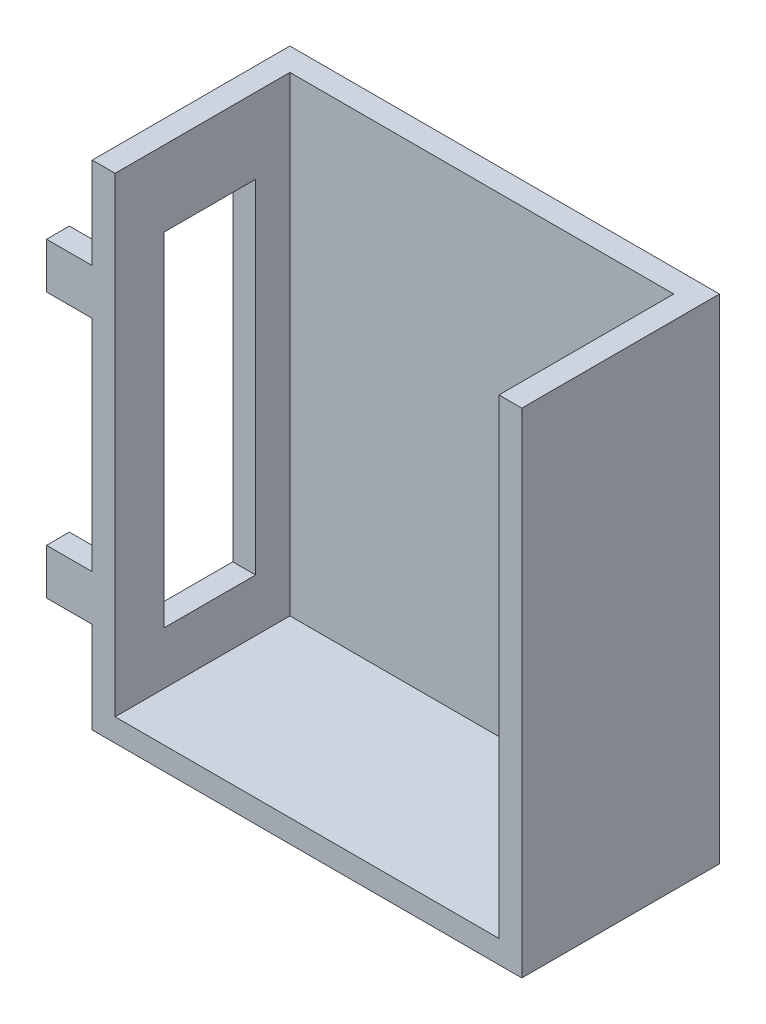
ISO-10303-21;
HEADER;
FILE_DESCRIPTION(('STEP AP214'),'2;1');
FILE_NAME('part.step','',(''),(''),'','','');
FILE_SCHEMA(('AUTOMOTIVE_DESIGN { 1 0 10303 214 1 1 1 1 }'));
ENDSEC;
DATA;
#1=APPLICATION_CONTEXT('core data for automotive mechanical design processes');
#2=APPLICATION_PROTOCOL_DEFINITION('international standard','automotive_design',2000,#1);
#3=PRODUCT_CONTEXT('',#1,'mechanical');
#4=PRODUCT('Part','Part','',(#3));
#5=PRODUCT_RELATED_PRODUCT_CATEGORY('part','',(#4));
#6=PRODUCT_DEFINITION_FORMATION('','',#4);
#7=PRODUCT_DEFINITION_CONTEXT('part definition',#1,'design');
#8=PRODUCT_DEFINITION('design','',#6,#7);
#9=PRODUCT_DEFINITION_SHAPE('','',#8);
#10=(LENGTH_UNIT() NAMED_UNIT(*) SI_UNIT(.MILLI.,.METRE.));
#11=(NAMED_UNIT(*) PLANE_ANGLE_UNIT() SI_UNIT($,.RADIAN.));
#12=(NAMED_UNIT(*) SI_UNIT($,.STERADIAN.) SOLID_ANGLE_UNIT());
#13=UNCERTAINTY_MEASURE_WITH_UNIT(LENGTH_MEASURE(1.E-05),#10,'distance_accuracy_value','');
#14=(GEOMETRIC_REPRESENTATION_CONTEXT(3) GLOBAL_UNCERTAINTY_ASSIGNED_CONTEXT((#13)) GLOBAL_UNIT_ASSIGNED_CONTEXT((#10,
#11,#12)) REPRESENTATION_CONTEXT('',''));
#15=CARTESIAN_POINT('',(0.,0.,0.));
#16=DIRECTION('',(0.,0.,1.));
#17=DIRECTION('',(1.,0.,0.));
#18=AXIS2_PLACEMENT_3D('',#15,#16,#17);
#19=CARTESIAN_POINT('',(-93.9999999999997,-113.,76.5));
#20=DIRECTION('',(0.,0.,1.));
#21=DIRECTION('',(0.,-1.,0.));
#22=AXIS2_PLACEMENT_3D('',#19,#20,#21);
#23=PLANE('',#22);
#24=DIRECTION('',(-1.,0.,0.));
#25=VECTOR('',#24,1.);
#26=CARTESIAN_POINT('',(-114.,-72.9999999999995,76.5));
#27=LINE('',#26,#25);
#28=CARTESIAN_POINT('',(-93.9999999999997,-72.9999999999995,76.5));
#29=VERTEX_POINT('',#28);
#30=CARTESIAN_POINT('',(-114.,-72.9999999999995,76.5));
#31=VERTEX_POINT('',#30);
#32=EDGE_CURVE('E334',#29,#31,#27,.T.);
#33=ORIENTED_EDGE('',*,*,#32,.F.);
#34=DIRECTION('',(0.,1.,0.));
#35=VECTOR('',#34,1.);
#36=CARTESIAN_POINT('',(-93.9999999999997,-103.,76.5));
#37=LINE('',#36,#35);
#38=CARTESIAN_POINT('',(-93.9999999999997,-113.,76.5));
#39=VERTEX_POINT('',#38);
#40=EDGE_CURVE('E275',#39,#29,#37,.T.);
#41=ORIENTED_EDGE('',*,*,#40,.F.);
#42=DIRECTION('',(-1.,0.,0.));
#43=VECTOR('',#42,1.);
#44=CARTESIAN_POINT('',(-83.9999999999998,-113.,76.5));
#45=LINE('',#44,#43);
#46=CARTESIAN_POINT('',(94.0000000000003,-113.,76.5));
#47=VERTEX_POINT('',#46);
#48=EDGE_CURVE('E263',#47,#39,#45,.T.);
#49=ORIENTED_EDGE('',*,*,#48,.F.);
#50=DIRECTION('',(0.,-1.,0.));
#51=VECTOR('',#50,1.);
#52=CARTESIAN_POINT('',(94.0000000000003,-103.,76.5));
#53=LINE('',#52,#51);
#54=CARTESIAN_POINT('',(94.0000000000002,103.,76.5));
#55=VERTEX_POINT('',#54);
#56=EDGE_CURVE('E279',#55,#47,#53,.T.);
#57=ORIENTED_EDGE('',*,*,#56,.F.);
#58=DIRECTION('',(1.,0.,0.));
#59=VECTOR('',#58,1.);
#60=CARTESIAN_POINT('',(-83.9999999999998,103.,76.5));
#61=LINE('',#60,#59);
#62=CARTESIAN_POINT('',(84.0000000000003,103.,76.5));
#63=VERTEX_POINT('',#62);
#64=EDGE_CURVE('E283',#63,#55,#61,.T.);
#65=ORIENTED_EDGE('',*,*,#64,.F.);
#66=DIRECTION('',(0.,-1.,0.));
#67=VECTOR('',#66,1.);
#68=CARTESIAN_POINT('',(84.0000000000003,-103.,76.5));
#69=LINE('',#68,#67);
#70=CARTESIAN_POINT('',(84.0000000000003,-103.,76.5));
#71=VERTEX_POINT('',#70);
#72=EDGE_CURVE('E289',#63,#71,#69,.T.);
#73=ORIENTED_EDGE('',*,*,#72,.T.);
#74=DIRECTION('',(-1.,0.,0.));
#75=VECTOR('',#74,1.);
#76=CARTESIAN_POINT('',(-83.9999999999998,-103.,76.5));
#77=LINE('',#76,#75);
#78=CARTESIAN_POINT('',(-83.9999999999998,-103.,76.5));
#79=VERTEX_POINT('',#78);
#80=EDGE_CURVE('E267',#71,#79,#77,.T.);
#81=ORIENTED_EDGE('',*,*,#80,.T.);
#82=DIRECTION('',(0.,1.,0.));
#83=VECTOR('',#82,1.);
#84=CARTESIAN_POINT('',(-83.9999999999998,-103.,76.5));
#85=LINE('',#84,#83);
#86=CARTESIAN_POINT('',(-83.9999999999998,103.,76.5));
#87=VERTEX_POINT('',#86);
#88=EDGE_CURVE('E271',#79,#87,#85,.T.);
#89=ORIENTED_EDGE('',*,*,#88,.T.);
#90=CARTESIAN_POINT('',(-93.9999999999997,103.,76.5));
#91=VERTEX_POINT('',#90);
#92=EDGE_CURVE('E286',#91,#87,#61,.T.);
#93=ORIENTED_EDGE('',*,*,#92,.F.);
#94=CARTESIAN_POINT('',(-93.9999999999997,63.0000000000004,76.5));
#95=VERTEX_POINT('',#94);
#96=EDGE_CURVE('E274',#95,#91,#37,.T.);
#97=ORIENTED_EDGE('',*,*,#96,.F.);
#98=DIRECTION('',(1.,0.,0.));
#99=VECTOR('',#98,1.);
#100=CARTESIAN_POINT('',(-114.,63.0000000000004,76.5));
#101=LINE('',#100,#99);
#102=CARTESIAN_POINT('',(-114.,63.0000000000004,76.5));
#103=VERTEX_POINT('',#102);
#104=EDGE_CURVE('E309',#103,#95,#101,.T.);
#105=ORIENTED_EDGE('',*,*,#104,.F.);
#106=DIRECTION('',(0.,1.,0.));
#107=VECTOR('',#106,1.);
#108=CARTESIAN_POINT('',(-114.,0.,76.5));
#109=LINE('',#108,#107);
#110=CARTESIAN_POINT('',(-114.,43.0000000000004,76.5));
#111=VERTEX_POINT('',#110);
#112=EDGE_CURVE('E295',#111,#103,#109,.T.);
#113=ORIENTED_EDGE('',*,*,#112,.F.);
#114=DIRECTION('',(1.,0.,0.));
#115=VECTOR('',#114,1.);
#116=CARTESIAN_POINT('',(-114.,43.0000000000004,76.5));
#117=LINE('',#116,#115);
#118=CARTESIAN_POINT('',(-93.9999999999997,43.0000000000004,76.5));
#119=VERTEX_POINT('',#118);
#120=EDGE_CURVE('E270',#111,#119,#117,.T.);
#121=ORIENTED_EDGE('',*,*,#120,.T.);
#122=CARTESIAN_POINT('',(-93.9999999999997,-52.9999999999995,76.5));
#123=VERTEX_POINT('',#122);
#124=EDGE_CURVE('E280',#123,#119,#37,.T.);
#125=ORIENTED_EDGE('',*,*,#124,.F.);
#126=DIRECTION('',(-1.,0.,0.));
#127=VECTOR('',#126,1.);
#128=CARTESIAN_POINT('',(-114.,-52.9999999999995,76.5));
#129=LINE('',#128,#127);
#130=CARTESIAN_POINT('',(-114.,-52.9999999999995,76.5));
#131=VERTEX_POINT('',#130);
#132=EDGE_CURVE('E321',#123,#131,#129,.T.);
#133=ORIENTED_EDGE('',*,*,#132,.T.);
#134=DIRECTION('',(0.,1.,0.));
#135=VECTOR('',#134,1.);
#136=CARTESIAN_POINT('',(-114.,0.,76.5));
#137=LINE('',#136,#135);
#138=EDGE_CURVE('E72',#31,#131,#137,.T.);
#139=ORIENTED_EDGE('',*,*,#138,.F.);
#140=EDGE_LOOP('',(#33,#41,#49,#57,#65,#73,#81,#89,#93,#97,#105,#113,#121,#125,#133,#139));
#141=FACE_BOUND('',#140,.T.);
#142=ADVANCED_FACE('F42',(#141),#23,.T.);
#143=CARTESIAN_POINT('',(-114.,-52.9999999999995,0.));
#144=DIRECTION('',(0.,-1.,0.));
#145=DIRECTION('',(0.,0.,-1.));
#146=AXIS2_PLACEMENT_3D('',#143,#144,#145);
#147=PLANE('',#146);
#148=ORIENTED_EDGE('',*,*,#132,.F.);
#149=DIRECTION('',(0.,0.,-1.));
#150=VECTOR('',#149,1.);
#151=CARTESIAN_POINT('',(-93.9999999999997,-52.9999999999995,0.));
#152=LINE('',#151,#150);
#153=CARTESIAN_POINT('',(-93.9999999999997,-52.9999999999995,66.5));
#154=VERTEX_POINT('',#153);
#155=EDGE_CURVE('E11',#123,#154,#152,.T.);
#156=ORIENTED_EDGE('',*,*,#155,.T.);
#157=DIRECTION('',(1.,0.,0.));
#158=VECTOR('',#157,1.);
#159=CARTESIAN_POINT('',(-114.,-52.9999999999995,66.5));
#160=LINE('',#159,#158);
#161=CARTESIAN_POINT('',(-114.,-52.9999999999995,66.5));
#162=VERTEX_POINT('',#161);
#163=EDGE_CURVE('E322',#162,#154,#160,.T.);
#164=ORIENTED_EDGE('',*,*,#163,.F.);
#165=DIRECTION('',(0.,0.,-1.));
#166=VECTOR('',#165,1.);
#167=CARTESIAN_POINT('',(-114.,-52.9999999999995,0.));
#168=LINE('',#167,#166);
#169=EDGE_CURVE('E331',#131,#162,#168,.T.);
#170=ORIENTED_EDGE('',*,*,#169,.F.);
#171=EDGE_LOOP('',(#148,#156,#164,#170));
#172=FACE_BOUND('',#171,.T.);
#173=ADVANCED_FACE('F412',(#172),#147,.F.);
#174=CARTESIAN_POINT('',(-114.,-72.9999999999995,0.));
#175=DIRECTION('',(0.,-1.,0.));
#176=DIRECTION('',(0.,0.,-1.));
#177=AXIS2_PLACEMENT_3D('',#174,#175,#176);
#178=PLANE('',#177);
#179=DIRECTION('',(0.,0.,-1.));
#180=VECTOR('',#179,1.);
#181=CARTESIAN_POINT('',(-93.9999999999997,-72.9999999999995,0.));
#182=LINE('',#181,#180);
#183=CARTESIAN_POINT('',(-93.9999999999997,-72.9999999999995,66.5));
#184=VERTEX_POINT('',#183);
#185=EDGE_CURVE('E327',#29,#184,#182,.T.);
#186=ORIENTED_EDGE('',*,*,#185,.F.);
#187=ORIENTED_EDGE('',*,*,#32,.T.);
#188=DIRECTION('',(0.,0.,-1.));
#189=VECTOR('',#188,1.);
#190=CARTESIAN_POINT('',(-114.,-72.9999999999995,0.));
#191=LINE('',#190,#189);
#192=CARTESIAN_POINT('',(-114.,-72.9999999999995,66.5));
#193=VERTEX_POINT('',#192);
#194=EDGE_CURVE('E67',#31,#193,#191,.T.);
#195=ORIENTED_EDGE('',*,*,#194,.T.);
#196=DIRECTION('',(1.,0.,0.));
#197=VECTOR('',#196,1.);
#198=CARTESIAN_POINT('',(-114.,-72.9999999999995,66.5));
#199=LINE('',#198,#197);
#200=EDGE_CURVE('E58',#193,#184,#199,.T.);
#201=ORIENTED_EDGE('',*,*,#200,.T.);
#202=EDGE_LOOP('',(#186,#187,#195,#201));
#203=FACE_BOUND('',#202,.T.);
#204=ADVANCED_FACE('F344',(#203),#178,.T.);
#205=CARTESIAN_POINT('',(-114.,0.,0.));
#206=DIRECTION('',(-1.,0.,0.));
#207=DIRECTION('',(0.,0.,1.));
#208=AXIS2_PLACEMENT_3D('',#205,#206,#207);
#209=PLANE('',#208);
#210=ORIENTED_EDGE('',*,*,#194,.F.);
#211=ORIENTED_EDGE('',*,*,#138,.T.);
#212=ORIENTED_EDGE('',*,*,#169,.T.);
#213=DIRECTION('',(0.,1.,0.));
#214=VECTOR('',#213,1.);
#215=CARTESIAN_POINT('',(-114.,0.,66.5));
#216=LINE('',#215,#214);
#217=EDGE_CURVE('E328',#193,#162,#216,.T.);
#218=ORIENTED_EDGE('',*,*,#217,.F.);
#219=EDGE_LOOP('',(#210,#211,#212,#218));
#220=FACE_BOUND('',#219,.T.);
#221=ADVANCED_FACE('F44',(#220),#209,.T.);
#222=CARTESIAN_POINT('',(-114.,0.,66.5));
#223=DIRECTION('',(0.,0.,-1.));
#224=DIRECTION('',(-1.,0.,0.));
#225=AXIS2_PLACEMENT_3D('',#222,#223,#224);
#226=PLANE('',#225);
#227=DIRECTION('',(0.,1.,0.));
#228=VECTOR('',#227,1.);
#229=CARTESIAN_POINT('',(-93.9999999999997,0.,66.5));
#230=LINE('',#229,#228);
#231=EDGE_CURVE('E51',#184,#154,#230,.T.);
#232=ORIENTED_EDGE('',*,*,#231,.F.);
#233=ORIENTED_EDGE('',*,*,#200,.F.);
#234=ORIENTED_EDGE('',*,*,#217,.T.);
#235=ORIENTED_EDGE('',*,*,#163,.T.);
#236=EDGE_LOOP('',(#232,#233,#234,#235));
#237=FACE_BOUND('',#236,.T.);
#238=ADVANCED_FACE('F408',(#237),#226,.T.);
#239=CARTESIAN_POINT('',(-93.9999999999997,-103.,103.));
#240=DIRECTION('',(1.,0.,0.));
#241=DIRECTION('',(0.,0.,-1.));
#242=AXIS2_PLACEMENT_3D('',#239,#240,#241);
#243=PLANE('',#242);
#244=DIRECTION('',(0.,-1.,0.));
#245=VECTOR('',#244,1.);
#246=CARTESIAN_POINT('',(-93.9999999999997,-79.9999999999995,15.));
#247=LINE('',#246,#245);
#248=CARTESIAN_POINT('',(-93.9999999999997,70.0000000000005,15.));
#249=VERTEX_POINT('',#248);
#250=CARTESIAN_POINT('',(-93.9999999999997,-79.9999999999995,15.));
#251=VERTEX_POINT('',#250);
#252=EDGE_CURVE('E200',#249,#251,#247,.T.);
#253=ORIENTED_EDGE('',*,*,#252,.F.);
#254=DIRECTION('',(0.,0.,-1.));
#255=VECTOR('',#254,1.);
#256=CARTESIAN_POINT('',(-93.9999999999997,70.0000000000005,15.));
#257=LINE('',#256,#255);
#258=CARTESIAN_POINT('',(-93.9999999999997,70.0000000000005,55.));
#259=VERTEX_POINT('',#258);
#260=EDGE_CURVE('E215',#259,#249,#257,.T.);
#261=ORIENTED_EDGE('',*,*,#260,.F.);
#262=DIRECTION('',(0.,1.,0.));
#263=VECTOR('',#262,1.);
#264=CARTESIAN_POINT('',(-93.9999999999997,-79.9999999999995,55.));
#265=LINE('',#264,#263);
#266=CARTESIAN_POINT('',(-93.9999999999997,-79.9999999999995,55.));
#267=VERTEX_POINT('',#266);
#268=EDGE_CURVE('E212',#267,#259,#265,.T.);
#269=ORIENTED_EDGE('',*,*,#268,.F.);
#270=DIRECTION('',(0.,0.,1.));
#271=VECTOR('',#270,1.);
#272=CARTESIAN_POINT('',(-93.9999999999997,-79.9999999999995,15.));
#273=LINE('',#272,#271);
#274=EDGE_CURVE('E219',#251,#267,#273,.T.);
#275=ORIENTED_EDGE('',*,*,#274,.F.);
#276=EDGE_LOOP('',(#253,#261,#269,#275));
#277=FACE_BOUND('',#276,.T.);
#278=ORIENTED_EDGE('',*,*,#40,.T.);
#279=ORIENTED_EDGE('',*,*,#185,.T.);
#280=ORIENTED_EDGE('',*,*,#231,.T.);
#281=ORIENTED_EDGE('',*,*,#155,.F.);
#282=ORIENTED_EDGE('',*,*,#124,.T.);
#283=DIRECTION('',(0.,0.,1.));
#284=VECTOR('',#283,1.);
#285=CARTESIAN_POINT('',(-93.9999999999997,43.0000000000004,0.));
#286=LINE('',#285,#284);
#287=CARTESIAN_POINT('',(-93.9999999999997,43.0000000000004,66.5));
#288=VERTEX_POINT('',#287);
#289=EDGE_CURVE('E302',#288,#119,#286,.T.);
#290=ORIENTED_EDGE('',*,*,#289,.F.);
#291=DIRECTION('',(0.,1.,0.));
#292=VECTOR('',#291,1.);
#293=CARTESIAN_POINT('',(-93.9999999999997,0.,66.5));
#294=LINE('',#293,#292);
#295=CARTESIAN_POINT('',(-93.9999999999997,63.0000000000004,66.5));
#296=VERTEX_POINT('',#295);
#297=EDGE_CURVE('E298',#288,#296,#294,.T.);
#298=ORIENTED_EDGE('',*,*,#297,.T.);
#299=DIRECTION('',(0.,0.,1.));
#300=VECTOR('',#299,1.);
#301=CARTESIAN_POINT('',(-93.9999999999997,63.0000000000004,0.));
#302=LINE('',#301,#300);
#303=EDGE_CURVE('E301',#296,#95,#302,.T.);
#304=ORIENTED_EDGE('',*,*,#303,.T.);
#305=ORIENTED_EDGE('',*,*,#96,.T.);
#306=DIRECTION('',(0.,0.,-1.));
#307=VECTOR('',#306,1.);
#308=CARTESIAN_POINT('',(-93.9999999999997,103.,103.));
#309=LINE('',#308,#307);
#310=CARTESIAN_POINT('',(-93.9999999999997,103.,-10.));
#311=VERTEX_POINT('',#310);
#312=EDGE_CURVE('E258',#91,#311,#309,.T.);
#313=ORIENTED_EDGE('',*,*,#312,.T.);
#314=DIRECTION('',(0.,-1.,0.));
#315=VECTOR('',#314,1.);
#316=CARTESIAN_POINT('',(-93.9999999999997,0.,-10.));
#317=LINE('',#316,#315);
#318=CARTESIAN_POINT('',(-93.9999999999997,-113.,-10.));
#319=VERTEX_POINT('',#318);
#320=EDGE_CURVE('E256',#311,#319,#317,.T.);
#321=ORIENTED_EDGE('',*,*,#320,.T.);
#322=DIRECTION('',(0.,0.,-1.));
#323=VECTOR('',#322,1.);
#324=CARTESIAN_POINT('',(-93.9999999999997,-113.,103.));
#325=LINE('',#324,#323);
#326=EDGE_CURVE('E252',#39,#319,#325,.T.);
#327=ORIENTED_EDGE('',*,*,#326,.F.);
#328=EDGE_LOOP('',(#278,#279,#280,#281,#282,#290,#298,#304,#305,#313,#321,#327));
#329=FACE_BOUND('',#328,.T.);
#330=ADVANCED_FACE('F340',(#277,#329),#243,.F.);
#331=CARTESIAN_POINT('',(-114.,63.0000000000004,0.));
#332=DIRECTION('',(0.,1.,0.));
#333=DIRECTION('',(0.,0.,1.));
#334=AXIS2_PLACEMENT_3D('',#331,#332,#333);
#335=PLANE('',#334);
#336=DIRECTION('',(0.,0.,1.));
#337=VECTOR('',#336,1.);
#338=CARTESIAN_POINT('',(-114.,63.0000000000004,0.));
#339=LINE('',#338,#337);
#340=CARTESIAN_POINT('',(-114.,63.0000000000004,66.5));
#341=VERTEX_POINT('',#340);
#342=EDGE_CURVE('E306',#341,#103,#339,.T.);
#343=ORIENTED_EDGE('',*,*,#342,.T.);
#344=ORIENTED_EDGE('',*,*,#104,.T.);
#345=ORIENTED_EDGE('',*,*,#303,.F.);
#346=DIRECTION('',(1.,0.,0.));
#347=VECTOR('',#346,1.);
#348=CARTESIAN_POINT('',(-114.,63.0000000000004,66.5));
#349=LINE('',#348,#347);
#350=EDGE_CURVE('E292',#341,#296,#349,.T.);
#351=ORIENTED_EDGE('',*,*,#350,.F.);
#352=EDGE_LOOP('',(#343,#344,#345,#351));
#353=FACE_BOUND('',#352,.T.);
#354=ADVANCED_FACE('F400',(#353),#335,.T.);
#355=CARTESIAN_POINT('',(-114.,43.0000000000004,0.));
#356=DIRECTION('',(0.,1.,0.));
#357=DIRECTION('',(0.,0.,1.));
#358=AXIS2_PLACEMENT_3D('',#355,#356,#357);
#359=PLANE('',#358);
#360=ORIENTED_EDGE('',*,*,#120,.F.);
#361=DIRECTION('',(0.,0.,1.));
#362=VECTOR('',#361,1.);
#363=CARTESIAN_POINT('',(-114.,43.0000000000004,0.));
#364=LINE('',#363,#362);
#365=CARTESIAN_POINT('',(-114.,43.0000000000004,66.5));
#366=VERTEX_POINT('',#365);
#367=EDGE_CURVE('E297',#366,#111,#364,.T.);
#368=ORIENTED_EDGE('',*,*,#367,.F.);
#369=DIRECTION('',(1.,0.,0.));
#370=VECTOR('',#369,1.);
#371=CARTESIAN_POINT('',(-114.,43.0000000000004,66.5));
#372=LINE('',#371,#370);
#373=EDGE_CURVE('E294',#366,#288,#372,.T.);
#374=ORIENTED_EDGE('',*,*,#373,.T.);
#375=ORIENTED_EDGE('',*,*,#289,.T.);
#376=EDGE_LOOP('',(#360,#368,#374,#375));
#377=FACE_BOUND('',#376,.T.);
#378=ADVANCED_FACE('F390',(#377),#359,.F.);
#379=CARTESIAN_POINT('',(-114.,0.,0.));
#380=DIRECTION('',(-1.,0.,0.));
#381=DIRECTION('',(0.,0.,1.));
#382=AXIS2_PLACEMENT_3D('',#379,#380,#381);
#383=PLANE('',#382);
#384=ORIENTED_EDGE('',*,*,#367,.T.);
#385=ORIENTED_EDGE('',*,*,#112,.T.);
#386=ORIENTED_EDGE('',*,*,#342,.F.);
#387=DIRECTION('',(0.,1.,0.));
#388=VECTOR('',#387,1.);
#389=CARTESIAN_POINT('',(-114.,0.,66.5));
#390=LINE('',#389,#388);
#391=EDGE_CURVE('E303',#366,#341,#390,.T.);
#392=ORIENTED_EDGE('',*,*,#391,.F.);
#393=EDGE_LOOP('',(#384,#385,#386,#392));
#394=FACE_BOUND('',#393,.T.);
#395=ADVANCED_FACE('F395',(#394),#383,.T.);
#396=CARTESIAN_POINT('',(-114.,0.,66.5));
#397=DIRECTION('',(0.,0.,-1.));
#398=DIRECTION('',(-1.,0.,0.));
#399=AXIS2_PLACEMENT_3D('',#396,#397,#398);
#400=PLANE('',#399);
#401=ORIENTED_EDGE('',*,*,#297,.F.);
#402=ORIENTED_EDGE('',*,*,#373,.F.);
#403=ORIENTED_EDGE('',*,*,#391,.T.);
#404=ORIENTED_EDGE('',*,*,#350,.T.);
#405=EDGE_LOOP('',(#401,#402,#403,#404));
#406=FACE_BOUND('',#405,.T.);
#407=ADVANCED_FACE('F398',(#406),#400,.T.);
#408=CARTESIAN_POINT('',(-83.9999999999998,103.,103.));
#409=DIRECTION('',(0.,-1.,0.));
#410=DIRECTION('',(0.,0.,-1.));
#411=AXIS2_PLACEMENT_3D('',#408,#409,#410);
#412=PLANE('',#411);
#413=ORIENTED_EDGE('',*,*,#312,.F.);
#414=ORIENTED_EDGE('',*,*,#92,.T.);
#415=DIRECTION('',(0.,0.,-1.));
#416=VECTOR('',#415,1.);
#417=CARTESIAN_POINT('',(-83.9999999999998,103.,103.));
#418=LINE('',#417,#416);
#419=CARTESIAN_POINT('',(-83.9999999999998,103.,0.));
#420=VERTEX_POINT('',#419);
#421=EDGE_CURVE('E242',#87,#420,#418,.T.);
#422=ORIENTED_EDGE('',*,*,#421,.T.);
#423=DIRECTION('',(-1.,0.,0.));
#424=VECTOR('',#423,1.);
#425=CARTESIAN_POINT('',(-83.9999999999998,103.,0.));
#426=LINE('',#425,#424);
#427=CARTESIAN_POINT('',(84.0000000000003,103.,0.));
#428=VERTEX_POINT('',#427);
#429=EDGE_CURVE('E229',#428,#420,#426,.T.);
#430=ORIENTED_EDGE('',*,*,#429,.F.);
#431=DIRECTION('',(0.,0.,-1.));
#432=VECTOR('',#431,1.);
#433=CARTESIAN_POINT('',(84.0000000000003,103.,103.));
#434=LINE('',#433,#432);
#435=EDGE_CURVE('E244',#63,#428,#434,.T.);
#436=ORIENTED_EDGE('',*,*,#435,.F.);
#437=ORIENTED_EDGE('',*,*,#64,.T.);
#438=DIRECTION('',(0.,0.,-1.));
#439=VECTOR('',#438,1.);
#440=CARTESIAN_POINT('',(94.0000000000002,103.,103.));
#441=LINE('',#440,#439);
#442=CARTESIAN_POINT('',(94.0000000000003,103.,-10.));
#443=VERTEX_POINT('',#442);
#444=EDGE_CURVE('E261',#55,#443,#441,.T.);
#445=ORIENTED_EDGE('',*,*,#444,.T.);
#446=DIRECTION('',(-1.,0.,0.));
#447=VECTOR('',#446,1.);
#448=CARTESIAN_POINT('',(0.,103.,-10.));
#449=LINE('',#448,#447);
#450=EDGE_CURVE('E249',#443,#311,#449,.T.);
#451=ORIENTED_EDGE('',*,*,#450,.T.);
#452=EDGE_LOOP('',(#413,#414,#422,#430,#436,#437,#445,#451));
#453=FACE_BOUND('',#452,.T.);
#454=ADVANCED_FACE('F365',(#453),#412,.F.);
#455=CARTESIAN_POINT('',(94.0000000000003,-103.,103.));
#456=DIRECTION('',(-1.,0.,0.));
#457=DIRECTION('',(0.,0.,1.));
#458=AXIS2_PLACEMENT_3D('',#455,#456,#457);
#459=PLANE('',#458);
#460=ORIENTED_EDGE('',*,*,#444,.F.);
#461=ORIENTED_EDGE('',*,*,#56,.T.);
#462=DIRECTION('',(0.,0.,-1.));
#463=VECTOR('',#462,1.);
#464=CARTESIAN_POINT('',(94.0000000000003,-113.,103.));
#465=LINE('',#464,#463);
#466=CARTESIAN_POINT('',(94.0000000000003,-113.,-10.));
#467=VERTEX_POINT('',#466);
#468=EDGE_CURVE('E250',#47,#467,#465,.T.);
#469=ORIENTED_EDGE('',*,*,#468,.T.);
#470=DIRECTION('',(0.,1.,0.));
#471=VECTOR('',#470,1.);
#472=CARTESIAN_POINT('',(94.0000000000003,0.,-10.));
#473=LINE('',#472,#471);
#474=EDGE_CURVE('E246',#467,#443,#473,.T.);
#475=ORIENTED_EDGE('',*,*,#474,.T.);
#476=EDGE_LOOP('',(#460,#461,#469,#475));
#477=FACE_BOUND('',#476,.T.);
#478=ADVANCED_FACE('F355',(#477),#459,.F.);
#479=CARTESIAN_POINT('',(-83.9999999999998,-113.,103.));
#480=DIRECTION('',(0.,1.,0.));
#481=DIRECTION('',(0.,0.,1.));
#482=AXIS2_PLACEMENT_3D('',#479,#480,#481);
#483=PLANE('',#482);
#484=ORIENTED_EDGE('',*,*,#468,.F.);
#485=ORIENTED_EDGE('',*,*,#48,.T.);
#486=ORIENTED_EDGE('',*,*,#326,.T.);
#487=DIRECTION('',(1.,0.,0.));
#488=VECTOR('',#487,1.);
#489=CARTESIAN_POINT('',(0.,-113.,-10.));
#490=LINE('',#489,#488);
#491=EDGE_CURVE('E253',#319,#467,#490,.T.);
#492=ORIENTED_EDGE('',*,*,#491,.T.);
#493=EDGE_LOOP('',(#484,#485,#486,#492));
#494=FACE_BOUND('',#493,.T.);
#495=ADVANCED_FACE('F351',(#494),#483,.F.);
#496=CARTESIAN_POINT('',(0.,0.,-10.));
#497=DIRECTION('',(0.,0.,-1.));
#498=DIRECTION('',(-1.,0.,0.));
#499=AXIS2_PLACEMENT_3D('',#496,#497,#498);
#500=PLANE('',#499);
#501=ORIENTED_EDGE('',*,*,#474,.F.);
#502=ORIENTED_EDGE('',*,*,#491,.F.);
#503=ORIENTED_EDGE('',*,*,#320,.F.);
#504=ORIENTED_EDGE('',*,*,#450,.F.);
#505=EDGE_LOOP('',(#501,#502,#503,#504));
#506=FACE_BOUND('',#505,.T.);
#507=ADVANCED_FACE('F450',(#506),#500,.T.);
#508=CARTESIAN_POINT('',(84.0000000000003,-103.,103.));
#509=DIRECTION('',(-1.,0.,0.));
#510=DIRECTION('',(0.,0.,1.));
#511=AXIS2_PLACEMENT_3D('',#508,#509,#510);
#512=PLANE('',#511);
#513=ORIENTED_EDGE('',*,*,#72,.F.);
#514=ORIENTED_EDGE('',*,*,#435,.T.);
#515=DIRECTION('',(0.,1.,0.));
#516=VECTOR('',#515,1.);
#517=CARTESIAN_POINT('',(84.0000000000003,-103.,0.));
#518=LINE('',#517,#516);
#519=CARTESIAN_POINT('',(84.0000000000003,-103.,0.));
#520=VERTEX_POINT('',#519);
#521=EDGE_CURVE('E226',#520,#428,#518,.T.);
#522=ORIENTED_EDGE('',*,*,#521,.F.);
#523=DIRECTION('',(0.,0.,-1.));
#524=VECTOR('',#523,1.);
#525=CARTESIAN_POINT('',(84.0000000000003,-103.,103.));
#526=LINE('',#525,#524);
#527=EDGE_CURVE('E238',#71,#520,#526,.T.);
#528=ORIENTED_EDGE('',*,*,#527,.F.);
#529=EDGE_LOOP('',(#513,#514,#522,#528));
#530=FACE_BOUND('',#529,.T.);
#531=ADVANCED_FACE('F361',(#530),#512,.T.);
#532=CARTESIAN_POINT('',(-83.9999999999998,-103.,103.));
#533=DIRECTION('',(1.,0.,0.));
#534=DIRECTION('',(0.,0.,-1.));
#535=AXIS2_PLACEMENT_3D('',#532,#533,#534);
#536=PLANE('',#535);
#537=DIRECTION('',(0.,0.,-1.));
#538=VECTOR('',#537,1.);
#539=CARTESIAN_POINT('',(-83.9999999999998,70.0000000000005,15.));
#540=LINE('',#539,#538);
#541=CARTESIAN_POINT('',(-83.9999999999998,70.0000000000005,55.));
#542=VERTEX_POINT('',#541);
#543=CARTESIAN_POINT('',(-83.9999999999998,70.0000000000005,15.));
#544=VERTEX_POINT('',#543);
#545=EDGE_CURVE('E208',#542,#544,#540,.T.);
#546=ORIENTED_EDGE('',*,*,#545,.T.);
#547=DIRECTION('',(0.,-1.,0.));
#548=VECTOR('',#547,1.);
#549=CARTESIAN_POINT('',(-83.9999999999998,-79.9999999999995,15.));
#550=LINE('',#549,#548);
#551=CARTESIAN_POINT('',(-83.9999999999998,-79.9999999999995,15.));
#552=VERTEX_POINT('',#551);
#553=EDGE_CURVE('E194',#544,#552,#550,.T.);
#554=ORIENTED_EDGE('',*,*,#553,.T.);
#555=DIRECTION('',(0.,0.,1.));
#556=VECTOR('',#555,1.);
#557=CARTESIAN_POINT('',(-83.9999999999998,-79.9999999999995,15.));
#558=LINE('',#557,#556);
#559=CARTESIAN_POINT('',(-83.9999999999998,-79.9999999999995,55.));
#560=VERTEX_POINT('',#559);
#561=EDGE_CURVE('E183',#552,#560,#558,.T.);
#562=ORIENTED_EDGE('',*,*,#561,.T.);
#563=DIRECTION('',(0.,1.,0.));
#564=VECTOR('',#563,1.);
#565=CARTESIAN_POINT('',(-83.9999999999998,-79.9999999999995,55.));
#566=LINE('',#565,#564);
#567=EDGE_CURVE('E193',#560,#542,#566,.T.);
#568=ORIENTED_EDGE('',*,*,#567,.T.);
#569=EDGE_LOOP('',(#546,#554,#562,#568));
#570=FACE_BOUND('',#569,.T.);
#571=ORIENTED_EDGE('',*,*,#88,.F.);
#572=DIRECTION('',(0.,0.,-1.));
#573=VECTOR('',#572,1.);
#574=CARTESIAN_POINT('',(-83.9999999999998,-103.,103.));
#575=LINE('',#574,#573);
#576=CARTESIAN_POINT('',(-83.9999999999998,-103.,0.));
#577=VERTEX_POINT('',#576);
#578=EDGE_CURVE('E240',#79,#577,#575,.T.);
#579=ORIENTED_EDGE('',*,*,#578,.T.);
#580=DIRECTION('',(0.,-1.,0.));
#581=VECTOR('',#580,1.);
#582=CARTESIAN_POINT('',(-83.9999999999998,-103.,0.));
#583=LINE('',#582,#581);
#584=EDGE_CURVE('E232',#420,#577,#583,.T.);
#585=ORIENTED_EDGE('',*,*,#584,.F.);
#586=ORIENTED_EDGE('',*,*,#421,.F.);
#587=EDGE_LOOP('',(#571,#579,#585,#586));
#588=FACE_BOUND('',#587,.T.);
#589=ADVANCED_FACE('F205',(#570,#588),#536,.T.);
#590=CARTESIAN_POINT('',(-83.9999999999998,-103.,103.));
#591=DIRECTION('',(0.,1.,0.));
#592=DIRECTION('',(0.,0.,1.));
#593=AXIS2_PLACEMENT_3D('',#590,#591,#592);
#594=PLANE('',#593);
#595=ORIENTED_EDGE('',*,*,#80,.F.);
#596=ORIENTED_EDGE('',*,*,#527,.T.);
#597=DIRECTION('',(1.,0.,0.));
#598=VECTOR('',#597,1.);
#599=CARTESIAN_POINT('',(-83.9999999999998,-103.,0.));
#600=LINE('',#599,#598);
#601=EDGE_CURVE('E235',#577,#520,#600,.T.);
#602=ORIENTED_EDGE('',*,*,#601,.F.);
#603=ORIENTED_EDGE('',*,*,#578,.F.);
#604=EDGE_LOOP('',(#595,#596,#602,#603));
#605=FACE_BOUND('',#604,.T.);
#606=ADVANCED_FACE('F373',(#605),#594,.T.);
#607=CARTESIAN_POINT('',(0.,0.,0.));
#608=DIRECTION('',(0.,0.,-1.));
#609=DIRECTION('',(-1.,0.,0.));
#610=AXIS2_PLACEMENT_3D('',#607,#608,#609);
#611=PLANE('',#610);
#612=ORIENTED_EDGE('',*,*,#521,.T.);
#613=ORIENTED_EDGE('',*,*,#429,.T.);
#614=ORIENTED_EDGE('',*,*,#584,.T.);
#615=ORIENTED_EDGE('',*,*,#601,.T.);
#616=EDGE_LOOP('',(#612,#613,#614,#615));
#617=FACE_BOUND('',#616,.T.);
#618=ADVANCED_FACE('F369',(#617),#611,.F.);
#619=CARTESIAN_POINT('',(94.0010000000002,70.0000000000005,15.));
#620=DIRECTION('',(0.,1.,0.));
#621=DIRECTION('',(0.,0.,1.));
#622=AXIS2_PLACEMENT_3D('',#619,#620,#621);
#623=PLANE('',#622);
#624=DIRECTION('',(-1.,0.,0.));
#625=VECTOR('',#624,1.);
#626=CARTESIAN_POINT('',(94.0010000000002,70.0000000000005,55.));
#627=LINE('',#626,#625);
#628=EDGE_CURVE('E221',#542,#259,#627,.T.);
#629=ORIENTED_EDGE('',*,*,#628,.T.);
#630=ORIENTED_EDGE('',*,*,#260,.T.);
#631=DIRECTION('',(-1.,0.,0.));
#632=VECTOR('',#631,1.);
#633=CARTESIAN_POINT('',(94.0010000000002,70.0000000000005,15.));
#634=LINE('',#633,#632);
#635=EDGE_CURVE('E202',#544,#249,#634,.T.);
#636=ORIENTED_EDGE('',*,*,#635,.F.);
#637=ORIENTED_EDGE('',*,*,#545,.F.);
#638=EDGE_LOOP('',(#629,#630,#636,#637));
#639=FACE_BOUND('',#638,.T.);
#640=ADVANCED_FACE('F433',(#639),#623,.F.);
#641=CARTESIAN_POINT('',(94.0010000000002,-79.9999999999995,15.));
#642=DIRECTION('',(0.,0.,-1.));
#643=DIRECTION('',(-1.,0.,0.));
#644=AXIS2_PLACEMENT_3D('',#641,#642,#643);
#645=PLANE('',#644);
#646=ORIENTED_EDGE('',*,*,#635,.T.);
#647=ORIENTED_EDGE('',*,*,#252,.T.);
#648=DIRECTION('',(-1.,0.,0.));
#649=VECTOR('',#648,1.);
#650=CARTESIAN_POINT('',(94.0010000000002,-79.9999999999995,15.));
#651=LINE('',#650,#649);
#652=EDGE_CURVE('E186',#552,#251,#651,.T.);
#653=ORIENTED_EDGE('',*,*,#652,.F.);
#654=ORIENTED_EDGE('',*,*,#553,.F.);
#655=EDGE_LOOP('',(#646,#647,#653,#654));
#656=FACE_BOUND('',#655,.T.);
#657=ADVANCED_FACE('F197',(#656),#645,.F.);
#658=CARTESIAN_POINT('',(94.0010000000002,-79.9999999999995,15.));
#659=DIRECTION('',(0.,-1.,0.));
#660=DIRECTION('',(0.,0.,-1.));
#661=AXIS2_PLACEMENT_3D('',#658,#659,#660);
#662=PLANE('',#661);
#663=ORIENTED_EDGE('',*,*,#652,.T.);
#664=ORIENTED_EDGE('',*,*,#274,.T.);
#665=DIRECTION('',(-1.,0.,0.));
#666=VECTOR('',#665,1.);
#667=CARTESIAN_POINT('',(94.0010000000002,-79.9999999999995,55.));
#668=LINE('',#667,#666);
#669=EDGE_CURVE('E189',#560,#267,#668,.T.);
#670=ORIENTED_EDGE('',*,*,#669,.F.);
#671=ORIENTED_EDGE('',*,*,#561,.F.);
#672=EDGE_LOOP('',(#663,#664,#670,#671));
#673=FACE_BOUND('',#672,.T.);
#674=ADVANCED_FACE('F185',(#673),#662,.F.);
#675=CARTESIAN_POINT('',(94.0010000000002,-79.9999999999995,55.));
#676=DIRECTION('',(0.,0.,1.));
#677=DIRECTION('',(1.,0.,0.));
#678=AXIS2_PLACEMENT_3D('',#675,#676,#677);
#679=PLANE('',#678);
#680=ORIENTED_EDGE('',*,*,#669,.T.);
#681=ORIENTED_EDGE('',*,*,#268,.T.);
#682=ORIENTED_EDGE('',*,*,#628,.F.);
#683=ORIENTED_EDGE('',*,*,#567,.F.);
#684=EDGE_LOOP('',(#680,#681,#682,#683));
#685=FACE_BOUND('',#684,.T.);
#686=ADVANCED_FACE('F445',(#685),#679,.F.);
#687=CLOSED_SHELL('',(#142,#173,#204,#221,#238,#330,#354,#378,#395,#407,#454,#478,#495,#507,
#531,#589,#606,#618,#640,#657,#674,#686));
#688=MANIFOLD_SOLID_BREP('B2',#687);
#689=ADVANCED_BREP_SHAPE_REPRESENTATION('',(#18,#688),#14);
#690=SHAPE_DEFINITION_REPRESENTATION(#9,#689);
ENDSEC;
END-ISO-10303-21;
